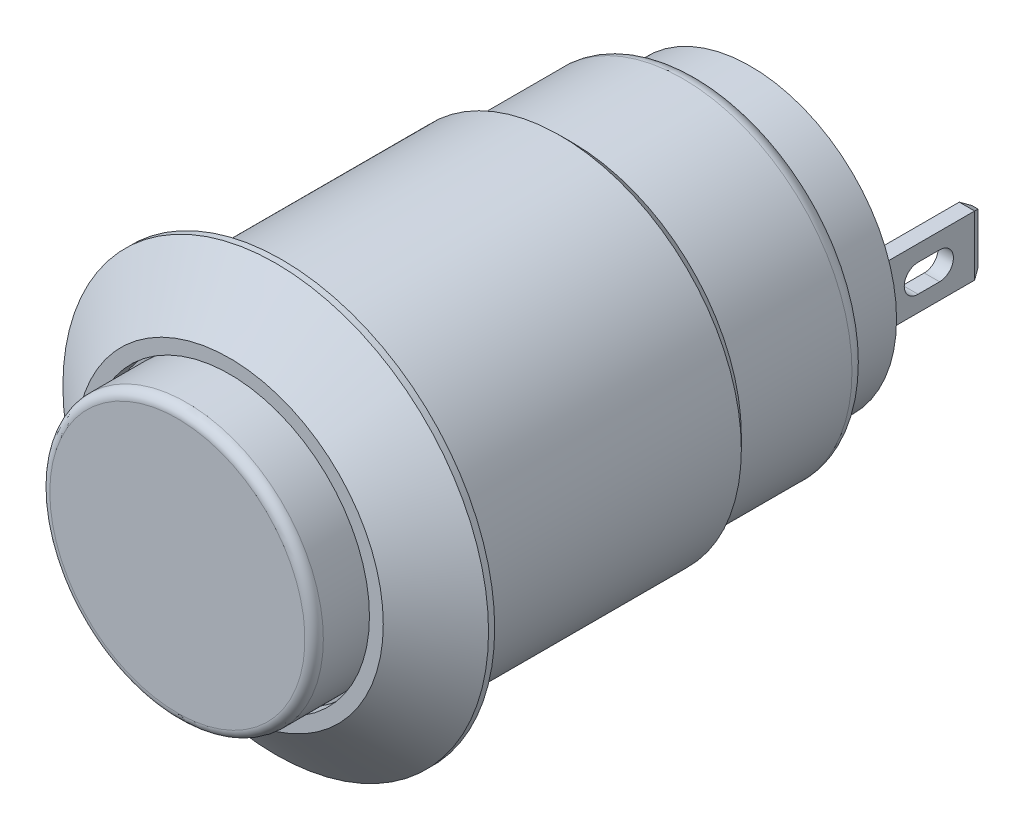
ISO-10303-21;
HEADER;
FILE_DESCRIPTION(('STEP AP214'),'2;1');
FILE_NAME('part.step','',(''),(''),'','','');
FILE_SCHEMA(('AUTOMOTIVE_DESIGN { 1 0 10303 214 1 1 1 1 }'));
ENDSEC;
DATA;
#1=APPLICATION_CONTEXT('core data for automotive mechanical design processes');
#2=APPLICATION_PROTOCOL_DEFINITION('international standard','automotive_design',2000,#1);
#3=PRODUCT_CONTEXT('',#1,'mechanical');
#4=PRODUCT('Part','Part','',(#3));
#5=PRODUCT_RELATED_PRODUCT_CATEGORY('part','',(#4));
#6=PRODUCT_DEFINITION_FORMATION('','',#4);
#7=PRODUCT_DEFINITION_CONTEXT('part definition',#1,'design');
#8=PRODUCT_DEFINITION('design','',#6,#7);
#9=PRODUCT_DEFINITION_SHAPE('','',#8);
#10=(LENGTH_UNIT() NAMED_UNIT(*) SI_UNIT(.MILLI.,.METRE.));
#11=(NAMED_UNIT(*) PLANE_ANGLE_UNIT() SI_UNIT($,.RADIAN.));
#12=(NAMED_UNIT(*) SI_UNIT($,.STERADIAN.) SOLID_ANGLE_UNIT());
#13=UNCERTAINTY_MEASURE_WITH_UNIT(LENGTH_MEASURE(1.E-05),#10,'distance_accuracy_value','');
#14=(GEOMETRIC_REPRESENTATION_CONTEXT(3) GLOBAL_UNCERTAINTY_ASSIGNED_CONTEXT((#13)) GLOBAL_UNIT_ASSIGNED_CONTEXT((#10,
#11,#12)) REPRESENTATION_CONTEXT('',''));
#15=CARTESIAN_POINT('',(0.,0.,0.));
#16=DIRECTION('',(0.,0.,1.));
#17=DIRECTION('',(1.,0.,0.));
#18=AXIS2_PLACEMENT_3D('',#15,#16,#17);
#19=CARTESIAN_POINT('',(0.,4.75,-18.65));
#20=DIRECTION('',(0.,0.,1.));
#21=DIRECTION('',(1.,0.,0.));
#22=AXIS2_PLACEMENT_3D('',#19,#20,#21);
#23=PLANE('',#22);
#24=DIRECTION('',(0.,1.,0.));
#25=VECTOR('',#24,1.);
#26=CARTESIAN_POINT('',(3.45,-0.975,-18.65));
#27=LINE('',#26,#25);
#28=CARTESIAN_POINT('',(3.45,-0.975,-18.65));
#29=VERTEX_POINT('',#28);
#30=CARTESIAN_POINT('',(3.45,0.975,-18.65));
#31=VERTEX_POINT('',#30);
#32=EDGE_CURVE('E389',#29,#31,#27,.T.);
#33=ORIENTED_EDGE('',*,*,#32,.F.);
#34=DIRECTION('',(-1.,0.,0.));
#35=VECTOR('',#34,1.);
#36=CARTESIAN_POINT('',(3.95,-0.975,-18.65));
#37=LINE('',#36,#35);
#38=CARTESIAN_POINT('',(3.95,-0.975,-18.65));
#39=VERTEX_POINT('',#38);
#40=EDGE_CURVE('E377',#39,#29,#37,.T.);
#41=ORIENTED_EDGE('',*,*,#40,.F.);
#42=DIRECTION('',(0.,-1.,0.));
#43=VECTOR('',#42,1.);
#44=CARTESIAN_POINT('',(3.95,-0.975,-18.65));
#45=LINE('',#44,#43);
#46=CARTESIAN_POINT('',(3.95,0.975,-18.65));
#47=VERTEX_POINT('',#46);
#48=EDGE_CURVE('E381',#47,#39,#45,.T.);
#49=ORIENTED_EDGE('',*,*,#48,.F.);
#50=DIRECTION('',(1.,0.,0.));
#51=VECTOR('',#50,1.);
#52=CARTESIAN_POINT('',(3.95,0.975,-18.65));
#53=LINE('',#52,#51);
#54=EDGE_CURVE('E385',#31,#47,#53,.T.);
#55=ORIENTED_EDGE('',*,*,#54,.F.);
#56=EDGE_LOOP('',(#33,#41,#49,#55));
#57=FACE_BOUND('',#56,.T.);
#58=CARTESIAN_POINT('',(0.,0.,-18.65));
#59=DIRECTION('',(0.,0.,1.));
#60=DIRECTION('',(1.,0.,0.));
#61=AXIS2_PLACEMENT_3D('',#58,#59,#60);
#62=CIRCLE('',#61,4.75);
#63=CARTESIAN_POINT('',(4.75,0.,-18.65));
#64=VERTEX_POINT('',#63);
#65=EDGE_CURVE('E361',#64,#64,#62,.T.);
#66=ORIENTED_EDGE('',*,*,#65,.F.);
#67=EDGE_LOOP('',(#66));
#68=FACE_BOUND('',#67,.T.);
#69=DIRECTION('',(0.,1.,0.));
#70=VECTOR('',#69,1.);
#71=CARTESIAN_POINT('',(-3.95,-0.975,-18.65));
#72=LINE('',#71,#70);
#73=CARTESIAN_POINT('',(-3.95,-0.975,-18.65));
#74=VERTEX_POINT('',#73);
#75=CARTESIAN_POINT('',(-3.95,0.975,-18.65));
#76=VERTEX_POINT('',#75);
#77=EDGE_CURVE('E244',#74,#76,#72,.T.);
#78=ORIENTED_EDGE('',*,*,#77,.F.);
#79=DIRECTION('',(-1.,0.,0.));
#80=VECTOR('',#79,1.);
#81=CARTESIAN_POINT('',(-3.45,-0.975,-18.65));
#82=LINE('',#81,#80);
#83=CARTESIAN_POINT('',(-3.45,-0.974999999999999,-18.65));
#84=VERTEX_POINT('',#83);
#85=EDGE_CURVE('E405',#84,#74,#82,.T.);
#86=ORIENTED_EDGE('',*,*,#85,.F.);
#87=DIRECTION('',(0.,-1.,0.));
#88=VECTOR('',#87,1.);
#89=CARTESIAN_POINT('',(-3.45,-0.975,-18.65));
#90=LINE('',#89,#88);
#91=CARTESIAN_POINT('',(-3.45,0.975,-18.65));
#92=VERTEX_POINT('',#91);
#93=EDGE_CURVE('E409',#92,#84,#90,.T.);
#94=ORIENTED_EDGE('',*,*,#93,.F.);
#95=DIRECTION('',(1.,0.,0.));
#96=VECTOR('',#95,1.);
#97=CARTESIAN_POINT('',(-3.45,0.975,-18.65));
#98=LINE('',#97,#96);
#99=EDGE_CURVE('E413',#76,#92,#98,.T.);
#100=ORIENTED_EDGE('',*,*,#99,.F.);
#101=EDGE_LOOP('',(#78,#86,#94,#100));
#102=FACE_BOUND('',#101,.T.);
#103=ADVANCED_FACE('F55',(#57,#68,#102),#23,.F.);
#104=CARTESIAN_POINT('',(0.,0.,0.));
#105=DIRECTION('',(0.,0.,-1.));
#106=DIRECTION('',(-1.,0.,0.));
#107=AXIS2_PLACEMENT_3D('',#104,#105,#106);
#108=PLANE('',#107);
#109=CARTESIAN_POINT('',(0.,0.,0.));
#110=DIRECTION('',(0.,0.,-1.));
#111=DIRECTION('',(-1.,0.,0.));
#112=AXIS2_PLACEMENT_3D('',#109,#110,#111);
#113=CIRCLE('',#112,4.15);
#114=CARTESIAN_POINT('',(-4.15,0.,0.));
#115=VERTEX_POINT('',#114);
#116=EDGE_CURVE('E309',#115,#115,#113,.F.);
#117=ORIENTED_EDGE('',*,*,#116,.T.);
#118=EDGE_LOOP('',(#117));
#119=FACE_BOUND('',#118,.T.);
#120=ADVANCED_FACE('F499',(#119),#108,.F.);
#121=CARTESIAN_POINT('',(0.,0.,0.));
#122=DIRECTION('',(0.,0.,1.));
#123=DIRECTION('',(1.,0.,0.));
#124=AXIS2_PLACEMENT_3D('',#121,#122,#123);
#125=CYLINDRICAL_SURFACE('',#124,4.45);
#126=CARTESIAN_POINT('',(0.,0.,-0.3));
#127=DIRECTION('',(0.,0.,-1.));
#128=DIRECTION('',(-1.,0.,0.));
#129=AXIS2_PLACEMENT_3D('',#126,#127,#128);
#130=CIRCLE('',#129,4.45);
#131=CARTESIAN_POINT('',(-4.45,0.,-0.3));
#132=VERTEX_POINT('',#131);
#133=EDGE_CURVE('E305',#132,#132,#130,.T.);
#134=ORIENTED_EDGE('',*,*,#133,.T.);
#135=EDGE_LOOP('',(#134));
#136=FACE_BOUND('',#135,.T.);
#137=CARTESIAN_POINT('',(0.,0.,-2.2));
#138=DIRECTION('',(0.,0.,1.));
#139=DIRECTION('',(1.,0.,0.));
#140=AXIS2_PLACEMENT_3D('',#137,#138,#139);
#141=CIRCLE('',#140,4.45);
#142=CARTESIAN_POINT('',(4.45,0.,-2.2));
#143=VERTEX_POINT('',#142);
#144=EDGE_CURVE('E321',#143,#143,#141,.T.);
#145=ORIENTED_EDGE('',*,*,#144,.T.);
#146=EDGE_LOOP('',(#145));
#147=FACE_BOUND('',#146,.T.);
#148=ADVANCED_FACE('F505',(#136,#147),#125,.T.);
#149=CARTESIAN_POINT('',(0.,4.45,-2.2));
#150=DIRECTION('',(0.,0.,-1.));
#151=DIRECTION('',(-1.,0.,0.));
#152=AXIS2_PLACEMENT_3D('',#149,#150,#151);
#153=PLANE('',#152);
#154=ORIENTED_EDGE('',*,*,#144,.F.);
#155=EDGE_LOOP('',(#154));
#156=FACE_BOUND('',#155,.T.);
#157=CARTESIAN_POINT('',(0.,0.,-2.2));
#158=DIRECTION('',(0.,0.,1.));
#159=DIRECTION('',(1.,0.,0.));
#160=AXIS2_PLACEMENT_3D('',#157,#158,#159);
#161=CIRCLE('',#160,4.55);
#162=CARTESIAN_POINT('',(4.55,0.,-2.2));
#163=VERTEX_POINT('',#162);
#164=EDGE_CURVE('E325',#163,#163,#161,.T.);
#165=ORIENTED_EDGE('',*,*,#164,.T.);
#166=EDGE_LOOP('',(#165));
#167=FACE_BOUND('',#166,.T.);
#168=ADVANCED_FACE('F554',(#156,#167),#153,.F.);
#169=CARTESIAN_POINT('',(0.,0.,0.));
#170=DIRECTION('',(0.,0.,1.));
#171=DIRECTION('',(1.,0.,0.));
#172=AXIS2_PLACEMENT_3D('',#169,#170,#171);
#173=CYLINDRICAL_SURFACE('',#172,4.55);
#174=ORIENTED_EDGE('',*,*,#164,.F.);
#175=EDGE_LOOP('',(#174));
#176=FACE_BOUND('',#175,.T.);
#177=CARTESIAN_POINT('',(0.,0.,-1.7));
#178=DIRECTION('',(0.,0.,1.));
#179=DIRECTION('',(1.,0.,0.));
#180=AXIS2_PLACEMENT_3D('',#177,#178,#179);
#181=CIRCLE('',#180,4.55);
#182=CARTESIAN_POINT('',(4.55,0.,-1.7));
#183=VERTEX_POINT('',#182);
#184=EDGE_CURVE('E329',#183,#183,#181,.T.);
#185=ORIENTED_EDGE('',*,*,#184,.T.);
#186=EDGE_LOOP('',(#185));
#187=FACE_BOUND('',#186,.T.);
#188=ADVANCED_FACE('F550',(#176,#187),#173,.F.);
#189=CARTESIAN_POINT('',(0.,4.55,-1.7));
#190=DIRECTION('',(0.,0.,-1.));
#191=DIRECTION('',(-1.,0.,0.));
#192=AXIS2_PLACEMENT_3D('',#189,#190,#191);
#193=PLANE('',#192);
#194=ORIENTED_EDGE('',*,*,#184,.F.);
#195=EDGE_LOOP('',(#194));
#196=FACE_BOUND('',#195,.T.);
#197=CARTESIAN_POINT('',(0.,0.,-1.7));
#198=DIRECTION('',(0.,0.,1.));
#199=DIRECTION('',(1.,0.,0.));
#200=AXIS2_PLACEMENT_3D('',#197,#198,#199);
#201=CIRCLE('',#200,5.);
#202=CARTESIAN_POINT('',(5.,0.,-1.7));
#203=VERTEX_POINT('',#202);
#204=EDGE_CURVE('E333',#203,#203,#201,.T.);
#205=ORIENTED_EDGE('',*,*,#204,.T.);
#206=EDGE_LOOP('',(#205));
#207=FACE_BOUND('',#206,.T.);
#208=ADVANCED_FACE('F546',(#196,#207),#193,.F.);
#209=CARTESIAN_POINT('',(0.,0.,-3.2));
#210=DIRECTION('',(0.,0.,-1.));
#211=DIRECTION('',(-1.,0.,0.));
#212=AXIS2_PLACEMENT_3D('',#209,#210,#211);
#213=CONICAL_SURFACE('',#212,6.925,0.908854685589389);
#214=ORIENTED_EDGE('',*,*,#204,.F.);
#215=EDGE_LOOP('',(#214));
#216=FACE_BOUND('',#215,.T.);
#217=CARTESIAN_POINT('',(0.,0.,-3.2));
#218=DIRECTION('',(0.,0.,1.));
#219=DIRECTION('',(1.,0.,0.));
#220=AXIS2_PLACEMENT_3D('',#217,#218,#219);
#221=CIRCLE('',#220,6.925);
#222=CARTESIAN_POINT('',(6.925,0.,-3.2));
#223=VERTEX_POINT('',#222);
#224=EDGE_CURVE('E337',#223,#223,#221,.T.);
#225=ORIENTED_EDGE('',*,*,#224,.T.);
#226=EDGE_LOOP('',(#225));
#227=FACE_BOUND('',#226,.T.);
#228=ADVANCED_FACE('F542',(#216,#227),#213,.T.);
#229=CARTESIAN_POINT('',(0.,0.,0.));
#230=DIRECTION('',(0.,0.,1.));
#231=DIRECTION('',(1.,0.,0.));
#232=AXIS2_PLACEMENT_3D('',#229,#230,#231);
#233=CYLINDRICAL_SURFACE('',#232,6.925);
#234=ORIENTED_EDGE('',*,*,#224,.F.);
#235=EDGE_LOOP('',(#234));
#236=FACE_BOUND('',#235,.T.);
#237=CARTESIAN_POINT('',(0.,0.,-3.4));
#238=DIRECTION('',(0.,0.,1.));
#239=DIRECTION('',(1.,0.,0.));
#240=AXIS2_PLACEMENT_3D('',#237,#238,#239);
#241=CIRCLE('',#240,6.925);
#242=CARTESIAN_POINT('',(6.925,0.,-3.4));
#243=VERTEX_POINT('',#242);
#244=EDGE_CURVE('E341',#243,#243,#241,.T.);
#245=ORIENTED_EDGE('',*,*,#244,.T.);
#246=EDGE_LOOP('',(#245));
#247=FACE_BOUND('',#246,.T.);
#248=ADVANCED_FACE('F538',(#236,#247),#233,.T.);
#249=CARTESIAN_POINT('',(0.,6.925,-3.4));
#250=DIRECTION('',(0.,0.,1.));
#251=DIRECTION('',(1.,0.,0.));
#252=AXIS2_PLACEMENT_3D('',#249,#250,#251);
#253=PLANE('',#252);
#254=ORIENTED_EDGE('',*,*,#244,.F.);
#255=EDGE_LOOP('',(#254));
#256=FACE_BOUND('',#255,.T.);
#257=CARTESIAN_POINT('',(0.,0.,-3.4));
#258=DIRECTION('',(0.,0.,1.));
#259=DIRECTION('',(1.,0.,0.));
#260=AXIS2_PLACEMENT_3D('',#257,#258,#259);
#261=CIRCLE('',#260,5.9);
#262=CARTESIAN_POINT('',(5.9,0.,-3.4));
#263=VERTEX_POINT('',#262);
#264=EDGE_CURVE('E345',#263,#263,#261,.T.);
#265=ORIENTED_EDGE('',*,*,#264,.T.);
#266=EDGE_LOOP('',(#265));
#267=FACE_BOUND('',#266,.T.);
#268=ADVANCED_FACE('F534',(#256,#267),#253,.F.);
#269=CARTESIAN_POINT('',(0.,0.,0.));
#270=DIRECTION('',(0.,0.,1.));
#271=DIRECTION('',(1.,0.,0.));
#272=AXIS2_PLACEMENT_3D('',#269,#270,#271);
#273=CYLINDRICAL_SURFACE('',#272,5.9);
#274=ORIENTED_EDGE('',*,*,#264,.F.);
#275=EDGE_LOOP('',(#274));
#276=FACE_BOUND('',#275,.T.);
#277=CARTESIAN_POINT('',(0.,0.,-12.45));
#278=DIRECTION('',(0.,0.,1.));
#279=DIRECTION('',(1.,0.,0.));
#280=AXIS2_PLACEMENT_3D('',#277,#278,#279);
#281=CIRCLE('',#280,5.9);
#282=CARTESIAN_POINT('',(5.9,0.,-12.45));
#283=VERTEX_POINT('',#282);
#284=EDGE_CURVE('E349',#283,#283,#281,.T.);
#285=ORIENTED_EDGE('',*,*,#284,.T.);
#286=EDGE_LOOP('',(#285));
#287=FACE_BOUND('',#286,.T.);
#288=ADVANCED_FACE('F530',(#276,#287),#273,.T.);
#289=CARTESIAN_POINT('',(0.,0.,-12.85));
#290=DIRECTION('',(0.,0.,1.));
#291=DIRECTION('',(1.,0.,0.));
#292=AXIS2_PLACEMENT_3D('',#289,#290,#291);
#293=CONICAL_SURFACE('',#292,5.5,0.785398163397453);
#294=ORIENTED_EDGE('',*,*,#284,.F.);
#295=EDGE_LOOP('',(#294));
#296=FACE_BOUND('',#295,.T.);
#297=CARTESIAN_POINT('',(0.,0.,-12.85));
#298=DIRECTION('',(0.,0.,1.));
#299=DIRECTION('',(1.,0.,0.));
#300=AXIS2_PLACEMENT_3D('',#297,#298,#299);
#301=CIRCLE('',#300,5.5);
#302=CARTESIAN_POINT('',(5.5,0.,-12.85));
#303=VERTEX_POINT('',#302);
#304=EDGE_CURVE('E353',#303,#303,#301,.T.);
#305=ORIENTED_EDGE('',*,*,#304,.T.);
#306=EDGE_LOOP('',(#305));
#307=FACE_BOUND('',#306,.T.);
#308=ADVANCED_FACE('F526',(#296,#307),#293,.T.);
#309=CARTESIAN_POINT('',(0.,0.,0.));
#310=DIRECTION('',(0.,0.,1.));
#311=DIRECTION('',(1.,0.,0.));
#312=AXIS2_PLACEMENT_3D('',#309,#310,#311);
#313=CYLINDRICAL_SURFACE('',#312,5.5);
#314=CARTESIAN_POINT('',(0.,0.,-16.45));
#315=DIRECTION('',(0.,0.,1.));
#316=DIRECTION('',(1.,0.,0.));
#317=AXIS2_PLACEMENT_3D('',#314,#315,#316);
#318=CIRCLE('',#317,5.5);
#319=CARTESIAN_POINT('',(5.5,0.,-16.45));
#320=VERTEX_POINT('',#319);
#321=EDGE_CURVE('E317',#320,#320,#318,.T.);
#322=ORIENTED_EDGE('',*,*,#321,.T.);
#323=EDGE_LOOP('',(#322));
#324=FACE_BOUND('',#323,.T.);
#325=ORIENTED_EDGE('',*,*,#304,.F.);
#326=EDGE_LOOP('',(#325));
#327=FACE_BOUND('',#326,.T.);
#328=ADVANCED_FACE('F522',(#324,#327),#313,.T.);
#329=CARTESIAN_POINT('',(0.,5.5,-16.95));
#330=DIRECTION('',(0.,0.,1.));
#331=DIRECTION('',(1.,0.,0.));
#332=AXIS2_PLACEMENT_3D('',#329,#330,#331);
#333=PLANE('',#332);
#334=CARTESIAN_POINT('',(0.,0.,-16.95));
#335=DIRECTION('',(0.,0.,1.));
#336=DIRECTION('',(1.,0.,0.));
#337=AXIS2_PLACEMENT_3D('',#334,#335,#336);
#338=CIRCLE('',#337,5.);
#339=CARTESIAN_POINT('',(5.,0.,-16.95));
#340=VERTEX_POINT('',#339);
#341=EDGE_CURVE('E313',#340,#340,#338,.F.);
#342=ORIENTED_EDGE('',*,*,#341,.T.);
#343=EDGE_LOOP('',(#342));
#344=FACE_BOUND('',#343,.T.);
#345=CARTESIAN_POINT('',(0.,0.,-16.95));
#346=DIRECTION('',(0.,0.,1.));
#347=DIRECTION('',(1.,0.,0.));
#348=AXIS2_PLACEMENT_3D('',#345,#346,#347);
#349=CIRCLE('',#348,4.75);
#350=CARTESIAN_POINT('',(4.75,0.,-16.95));
#351=VERTEX_POINT('',#350);
#352=EDGE_CURVE('E357',#351,#351,#349,.T.);
#353=ORIENTED_EDGE('',*,*,#352,.T.);
#354=EDGE_LOOP('',(#353));
#355=FACE_BOUND('',#354,.T.);
#356=ADVANCED_FACE('F518',(#344,#355),#333,.F.);
#357=CARTESIAN_POINT('',(0.,0.,0.));
#358=DIRECTION('',(0.,0.,1.));
#359=DIRECTION('',(1.,0.,0.));
#360=AXIS2_PLACEMENT_3D('',#357,#358,#359);
#361=CYLINDRICAL_SURFACE('',#360,4.75);
#362=ORIENTED_EDGE('',*,*,#352,.F.);
#363=EDGE_LOOP('',(#362));
#364=FACE_BOUND('',#363,.T.);
#365=ORIENTED_EDGE('',*,*,#65,.T.);
#366=EDGE_LOOP('',(#365));
#367=FACE_BOUND('',#366,.T.);
#368=ADVANCED_FACE('F514',(#364,#367),#361,.T.);
#369=CARTESIAN_POINT('',(0.,0.,-16.45));
#370=DIRECTION('',(0.,0.,1.));
#371=DIRECTION('',(1.,0.,0.));
#372=AXIS2_PLACEMENT_3D('',#369,#370,#371);
#373=TOROIDAL_SURFACE('',#372,5.,0.5);
#374=ORIENTED_EDGE('',*,*,#341,.F.);
#375=EDGE_LOOP('',(#374));
#376=FACE_BOUND('',#375,.T.);
#377=ORIENTED_EDGE('',*,*,#321,.F.);
#378=EDGE_LOOP('',(#377));
#379=FACE_BOUND('',#378,.T.);
#380=ADVANCED_FACE('F517',(#376,#379),#373,.T.);
#381=CARTESIAN_POINT('',(0.,0.,-0.3));
#382=DIRECTION('',(0.,0.,-1.));
#383=DIRECTION('',(-1.,0.,0.));
#384=AXIS2_PLACEMENT_3D('',#381,#382,#383);
#385=TOROIDAL_SURFACE('',#384,4.15,0.3);
#386=ORIENTED_EDGE('',*,*,#133,.F.);
#387=EDGE_LOOP('',(#386));
#388=FACE_BOUND('',#387,.T.);
#389=ORIENTED_EDGE('',*,*,#116,.F.);
#390=EDGE_LOOP('',(#389));
#391=FACE_BOUND('',#390,.T.);
#392=ADVANCED_FACE('F564',(#388,#391),#385,.T.);
#393=CARTESIAN_POINT('',(3.45,-0.975,-22.25));
#394=DIRECTION('',(1.,0.,0.));
#395=DIRECTION('',(0.,0.,-1.));
#396=AXIS2_PLACEMENT_3D('',#393,#394,#395);
#397=PLANE('',#396);
#398=DIRECTION('',(0.,0.,1.));
#399=VECTOR('',#398,1.);
#400=CARTESIAN_POINT('',(3.45,0.45,-22.25));
#401=LINE('',#400,#399);
#402=CARTESIAN_POINT('',(3.45,0.45,-20.85));
#403=VERTEX_POINT('',#402);
#404=CARTESIAN_POINT('',(3.45,0.45,-20.15));
#405=VERTEX_POINT('',#404);
#406=EDGE_CURVE('E431',#403,#405,#401,.T.);
#407=ORIENTED_EDGE('',*,*,#406,.T.);
#408=CARTESIAN_POINT('',(3.45,0.,-20.15));
#409=DIRECTION('',(1.,0.,0.));
#410=DIRECTION('',(0.,0.,-1.));
#411=AXIS2_PLACEMENT_3D('',#408,#409,#410);
#412=CIRCLE('',#411,0.45);
#413=CARTESIAN_POINT('',(3.45,-0.45,-20.15));
#414=VERTEX_POINT('',#413);
#415=EDGE_CURVE('E239',#405,#414,#412,.T.);
#416=ORIENTED_EDGE('',*,*,#415,.T.);
#417=DIRECTION('',(0.,0.,-1.));
#418=VECTOR('',#417,1.);
#419=CARTESIAN_POINT('',(3.45,-0.45,-22.25));
#420=LINE('',#419,#418);
#421=CARTESIAN_POINT('',(3.45,-0.45,-20.85));
#422=VERTEX_POINT('',#421);
#423=EDGE_CURVE('E453',#414,#422,#420,.T.);
#424=ORIENTED_EDGE('',*,*,#423,.T.);
#425=CARTESIAN_POINT('',(3.45,0.,-20.85));
#426=DIRECTION('',(1.,0.,0.));
#427=DIRECTION('',(0.,0.,-1.));
#428=AXIS2_PLACEMENT_3D('',#425,#426,#427);
#429=CIRCLE('',#428,0.45);
#430=EDGE_CURVE('E443',#422,#403,#429,.T.);
#431=ORIENTED_EDGE('',*,*,#430,.T.);
#432=EDGE_LOOP('',(#407,#416,#424,#431));
#433=FACE_BOUND('',#432,.T.);
#434=DIRECTION('',(0.,0.,1.));
#435=VECTOR('',#434,1.);
#436=CARTESIAN_POINT('',(3.45,0.975,-22.25));
#437=LINE('',#436,#435);
#438=CARTESIAN_POINT('',(3.45,0.975,-21.9901923788647));
#439=VERTEX_POINT('',#438);
#440=EDGE_CURVE('E365',#439,#31,#437,.T.);
#441=ORIENTED_EDGE('',*,*,#440,.F.);
#442=DIRECTION('',(0.,-1.,0.));
#443=VECTOR('',#442,1.);
#444=CARTESIAN_POINT('',(3.45,-0.975,-21.9901923788647));
#445=LINE('',#444,#443);
#446=CARTESIAN_POINT('',(3.45,-0.975,-21.9901923788647));
#447=VERTEX_POINT('',#446);
#448=EDGE_CURVE('E204',#439,#447,#445,.T.);
#449=ORIENTED_EDGE('',*,*,#448,.T.);
#450=DIRECTION('',(0.,0.,1.));
#451=VECTOR('',#450,1.);
#452=CARTESIAN_POINT('',(3.45,-0.975,-22.25));
#453=LINE('',#452,#451);
#454=EDGE_CURVE('E374',#447,#29,#453,.T.);
#455=ORIENTED_EDGE('',*,*,#454,.T.);
#456=ORIENTED_EDGE('',*,*,#32,.T.);
#457=EDGE_LOOP('',(#441,#449,#455,#456));
#458=FACE_BOUND('',#457,.T.);
#459=ADVANCED_FACE('F512',(#433,#458),#397,.F.);
#460=CARTESIAN_POINT('',(3.95,0.975,-22.25));
#461=DIRECTION('',(0.,-1.,0.));
#462=DIRECTION('',(0.,0.,-1.));
#463=AXIS2_PLACEMENT_3D('',#460,#461,#462);
#464=PLANE('',#463);
#465=DIRECTION('',(0.,0.,1.));
#466=VECTOR('',#465,1.);
#467=CARTESIAN_POINT('',(3.95,0.975,-22.25));
#468=LINE('',#467,#466);
#469=CARTESIAN_POINT('',(3.95,0.975,-21.9901923788647));
#470=VERTEX_POINT('',#469);
#471=EDGE_CURVE('E368',#470,#47,#468,.T.);
#472=ORIENTED_EDGE('',*,*,#471,.F.);
#473=DIRECTION('',(-1.,0.,0.));
#474=VECTOR('',#473,1.);
#475=CARTESIAN_POINT('',(3.95,0.975,-21.9901923788647));
#476=LINE('',#475,#474);
#477=EDGE_CURVE('E256',#470,#439,#476,.T.);
#478=ORIENTED_EDGE('',*,*,#477,.T.);
#479=ORIENTED_EDGE('',*,*,#440,.T.);
#480=ORIENTED_EDGE('',*,*,#54,.T.);
#481=EDGE_LOOP('',(#472,#478,#479,#480));
#482=FACE_BOUND('',#481,.T.);
#483=ADVANCED_FACE('F631',(#482),#464,.F.);
#484=CARTESIAN_POINT('',(3.95,-0.975,-22.25));
#485=DIRECTION('',(-1.,0.,0.));
#486=DIRECTION('',(0.,0.,1.));
#487=AXIS2_PLACEMENT_3D('',#484,#485,#486);
#488=PLANE('',#487);
#489=DIRECTION('',(0.,0.,1.));
#490=VECTOR('',#489,1.);
#491=CARTESIAN_POINT('',(3.95,-0.45,-22.25));
#492=LINE('',#491,#490);
#493=CARTESIAN_POINT('',(3.95,-0.45,-20.85));
#494=VERTEX_POINT('',#493);
#495=CARTESIAN_POINT('',(3.95,-0.45,-20.15));
#496=VERTEX_POINT('',#495);
#497=EDGE_CURVE('E456',#494,#496,#492,.T.);
#498=ORIENTED_EDGE('',*,*,#497,.T.);
#499=CARTESIAN_POINT('',(3.95,0.,-20.15));
#500=DIRECTION('',(-1.,0.,0.));
#501=DIRECTION('',(0.,0.,1.));
#502=AXIS2_PLACEMENT_3D('',#499,#500,#501);
#503=CIRCLE('',#502,0.45);
#504=CARTESIAN_POINT('',(3.95,0.45,-20.15));
#505=VERTEX_POINT('',#504);
#506=EDGE_CURVE('E423',#496,#505,#503,.T.);
#507=ORIENTED_EDGE('',*,*,#506,.T.);
#508=DIRECTION('',(0.,0.,-1.));
#509=VECTOR('',#508,1.);
#510=CARTESIAN_POINT('',(3.95,0.45,-22.25));
#511=LINE('',#510,#509);
#512=CARTESIAN_POINT('',(3.95,0.45,-20.85));
#513=VERTEX_POINT('',#512);
#514=EDGE_CURVE('E435',#505,#513,#511,.T.);
#515=ORIENTED_EDGE('',*,*,#514,.T.);
#516=CARTESIAN_POINT('',(3.95,0.,-20.85));
#517=DIRECTION('',(-1.,0.,0.));
#518=DIRECTION('',(0.,0.,1.));
#519=AXIS2_PLACEMENT_3D('',#516,#517,#518);
#520=CIRCLE('',#519,0.45);
#521=EDGE_CURVE('E447',#513,#494,#520,.T.);
#522=ORIENTED_EDGE('',*,*,#521,.T.);
#523=EDGE_LOOP('',(#498,#507,#515,#522));
#524=FACE_BOUND('',#523,.T.);
#525=DIRECTION('',(0.,0.,1.));
#526=VECTOR('',#525,1.);
#527=CARTESIAN_POINT('',(3.95,-0.975,-22.25));
#528=LINE('',#527,#526);
#529=CARTESIAN_POINT('',(3.95,-0.975,-21.9901923788647));
#530=VERTEX_POINT('',#529);
#531=EDGE_CURVE('E371',#530,#39,#528,.T.);
#532=ORIENTED_EDGE('',*,*,#531,.F.);
#533=DIRECTION('',(0.,1.,0.));
#534=VECTOR('',#533,1.);
#535=CARTESIAN_POINT('',(3.95,-0.975,-21.9901923788647));
#536=LINE('',#535,#534);
#537=EDGE_CURVE('E259',#530,#470,#536,.T.);
#538=ORIENTED_EDGE('',*,*,#537,.T.);
#539=ORIENTED_EDGE('',*,*,#471,.T.);
#540=ORIENTED_EDGE('',*,*,#48,.T.);
#541=EDGE_LOOP('',(#532,#538,#539,#540));
#542=FACE_BOUND('',#541,.T.);
#543=ADVANCED_FACE('F642',(#524,#542),#488,.F.);
#544=CARTESIAN_POINT('',(3.95,-0.975,-22.25));
#545=DIRECTION('',(0.,1.,0.));
#546=DIRECTION('',(0.,0.,1.));
#547=AXIS2_PLACEMENT_3D('',#544,#545,#546);
#548=PLANE('',#547);
#549=ORIENTED_EDGE('',*,*,#454,.F.);
#550=DIRECTION('',(1.,0.,0.));
#551=VECTOR('',#550,1.);
#552=CARTESIAN_POINT('',(3.95,-0.975,-21.9901923788647));
#553=LINE('',#552,#551);
#554=EDGE_CURVE('E262',#447,#530,#553,.T.);
#555=ORIENTED_EDGE('',*,*,#554,.T.);
#556=ORIENTED_EDGE('',*,*,#531,.T.);
#557=ORIENTED_EDGE('',*,*,#40,.T.);
#558=EDGE_LOOP('',(#549,#555,#556,#557));
#559=FACE_BOUND('',#558,.T.);
#560=ADVANCED_FACE('F638',(#559),#548,.F.);
#561=CARTESIAN_POINT('',(0.,0.,-22.25));
#562=DIRECTION('',(0.,0.,1.));
#563=DIRECTION('',(1.,0.,0.));
#564=AXIS2_PLACEMENT_3D('',#561,#562,#563);
#565=PLANE('',#564);
#566=DIRECTION('',(0.,-1.,0.));
#567=VECTOR('',#566,1.);
#568=CARTESIAN_POINT('',(3.8,0.,-22.25));
#569=LINE('',#568,#567);
#570=CARTESIAN_POINT('',(3.8,0.824999999999996,-22.25));
#571=VERTEX_POINT('',#570);
#572=CARTESIAN_POINT('',(3.8,-0.824999999999996,-22.25));
#573=VERTEX_POINT('',#572);
#574=EDGE_CURVE('E270',#571,#573,#569,.T.);
#575=ORIENTED_EDGE('',*,*,#574,.T.);
#576=DIRECTION('',(-1.,0.,0.));
#577=VECTOR('',#576,1.);
#578=CARTESIAN_POINT('',(0.,-0.824999999999996,-22.25));
#579=LINE('',#578,#577);
#580=CARTESIAN_POINT('',(3.6,-0.824999999999996,-22.25));
#581=VERTEX_POINT('',#580);
#582=EDGE_CURVE('E266',#573,#581,#579,.T.);
#583=ORIENTED_EDGE('',*,*,#582,.T.);
#584=DIRECTION('',(0.,1.,0.));
#585=VECTOR('',#584,1.);
#586=CARTESIAN_POINT('',(3.6,0.,-22.25));
#587=LINE('',#586,#585);
#588=CARTESIAN_POINT('',(3.6,0.824999999999996,-22.25));
#589=VERTEX_POINT('',#588);
#590=EDGE_CURVE('E276',#581,#589,#587,.T.);
#591=ORIENTED_EDGE('',*,*,#590,.T.);
#592=DIRECTION('',(1.,0.,0.));
#593=VECTOR('',#592,1.);
#594=CARTESIAN_POINT('',(0.,0.824999999999996,-22.25));
#595=LINE('',#594,#593);
#596=EDGE_CURVE('E273',#589,#571,#595,.T.);
#597=ORIENTED_EDGE('',*,*,#596,.T.);
#598=EDGE_LOOP('',(#575,#583,#591,#597));
#599=FACE_BOUND('',#598,.T.);
#600=ADVANCED_FACE('F649',(#599),#565,.F.);
#601=CARTESIAN_POINT('',(-3.95,-0.975,-22.25));
#602=DIRECTION('',(1.,0.,0.));
#603=DIRECTION('',(0.,0.,-1.));
#604=AXIS2_PLACEMENT_3D('',#601,#602,#603);
#605=PLANE('',#604);
#606=DIRECTION('',(0.,0.,1.));
#607=VECTOR('',#606,1.);
#608=CARTESIAN_POINT('',(-3.95,0.45,-22.25));
#609=LINE('',#608,#607);
#610=CARTESIAN_POINT('',(-3.95,0.45,-20.85));
#611=VERTEX_POINT('',#610);
#612=CARTESIAN_POINT('',(-3.95,0.45,-20.15));
#613=VERTEX_POINT('',#612);
#614=EDGE_CURVE('E439',#611,#613,#609,.T.);
#615=ORIENTED_EDGE('',*,*,#614,.T.);
#616=CARTESIAN_POINT('',(-3.95,0.,-20.15));
#617=DIRECTION('',(1.,0.,0.));
#618=DIRECTION('',(0.,0.,-1.));
#619=AXIS2_PLACEMENT_3D('',#616,#617,#618);
#620=CIRCLE('',#619,0.45);
#621=CARTESIAN_POINT('',(-3.95,-0.45,-20.15));
#622=VERTEX_POINT('',#621);
#623=EDGE_CURVE('E427',#613,#622,#620,.T.);
#624=ORIENTED_EDGE('',*,*,#623,.T.);
#625=DIRECTION('',(0.,0.,-1.));
#626=VECTOR('',#625,1.);
#627=CARTESIAN_POINT('',(-3.95,-0.45,-22.25));
#628=LINE('',#627,#626);
#629=CARTESIAN_POINT('',(-3.95,-0.45,-20.85));
#630=VERTEX_POINT('',#629);
#631=EDGE_CURVE('E460',#622,#630,#628,.T.);
#632=ORIENTED_EDGE('',*,*,#631,.T.);
#633=CARTESIAN_POINT('',(-3.95,0.,-20.85));
#634=DIRECTION('',(1.,0.,0.));
#635=DIRECTION('',(0.,0.,-1.));
#636=AXIS2_PLACEMENT_3D('',#633,#634,#635);
#637=CIRCLE('',#636,0.45);
#638=EDGE_CURVE('E211',#630,#611,#637,.T.);
#639=ORIENTED_EDGE('',*,*,#638,.T.);
#640=EDGE_LOOP('',(#615,#624,#632,#639));
#641=FACE_BOUND('',#640,.T.);
#642=DIRECTION('',(0.,0.,1.));
#643=VECTOR('',#642,1.);
#644=CARTESIAN_POINT('',(-3.95,0.975,-22.25));
#645=LINE('',#644,#643);
#646=CARTESIAN_POINT('',(-3.95,0.975,-21.9901923788647));
#647=VERTEX_POINT('',#646);
#648=EDGE_CURVE('E393',#647,#76,#645,.T.);
#649=ORIENTED_EDGE('',*,*,#648,.F.);
#650=DIRECTION('',(0.,-1.,0.));
#651=VECTOR('',#650,1.);
#652=CARTESIAN_POINT('',(-3.95,-0.975,-21.9901923788647));
#653=LINE('',#652,#651);
#654=CARTESIAN_POINT('',(-3.95,-0.975,-21.9901923788647));
#655=VERTEX_POINT('',#654);
#656=EDGE_CURVE('E279',#647,#655,#653,.T.);
#657=ORIENTED_EDGE('',*,*,#656,.T.);
#658=DIRECTION('',(0.,0.,1.));
#659=VECTOR('',#658,1.);
#660=CARTESIAN_POINT('',(-3.95,-0.975,-22.25));
#661=LINE('',#660,#659);
#662=EDGE_CURVE('E402',#655,#74,#661,.T.);
#663=ORIENTED_EDGE('',*,*,#662,.T.);
#664=ORIENTED_EDGE('',*,*,#77,.T.);
#665=EDGE_LOOP('',(#649,#657,#663,#664));
#666=FACE_BOUND('',#665,.T.);
#667=ADVANCED_FACE('F483',(#641,#666),#605,.F.);
#668=CARTESIAN_POINT('',(-3.45,0.975,-22.25));
#669=DIRECTION('',(0.,-1.,0.));
#670=DIRECTION('',(0.,0.,-1.));
#671=AXIS2_PLACEMENT_3D('',#668,#669,#670);
#672=PLANE('',#671);
#673=DIRECTION('',(0.,0.,1.));
#674=VECTOR('',#673,1.);
#675=CARTESIAN_POINT('',(-3.45,0.975,-22.25));
#676=LINE('',#675,#674);
#677=CARTESIAN_POINT('',(-3.45,0.975,-21.9901923788647));
#678=VERTEX_POINT('',#677);
#679=EDGE_CURVE('E396',#678,#92,#676,.T.);
#680=ORIENTED_EDGE('',*,*,#679,.F.);
#681=DIRECTION('',(-1.,0.,0.));
#682=VECTOR('',#681,1.);
#683=CARTESIAN_POINT('',(-3.45,0.975,-21.9901923788647));
#684=LINE('',#683,#682);
#685=EDGE_CURVE('E282',#678,#647,#684,.T.);
#686=ORIENTED_EDGE('',*,*,#685,.T.);
#687=ORIENTED_EDGE('',*,*,#648,.T.);
#688=ORIENTED_EDGE('',*,*,#99,.T.);
#689=EDGE_LOOP('',(#680,#686,#687,#688));
#690=FACE_BOUND('',#689,.T.);
#691=ADVANCED_FACE('F657',(#690),#672,.F.);
#692=CARTESIAN_POINT('',(-3.45,-0.975,-22.25));
#693=DIRECTION('',(-1.,0.,0.));
#694=DIRECTION('',(0.,0.,1.));
#695=AXIS2_PLACEMENT_3D('',#692,#693,#694);
#696=PLANE('',#695);
#697=DIRECTION('',(0.,0.,1.));
#698=VECTOR('',#697,1.);
#699=CARTESIAN_POINT('',(-3.45,-0.45,-22.25));
#700=LINE('',#699,#698);
#701=CARTESIAN_POINT('',(-3.45,-0.45,-20.85));
#702=VERTEX_POINT('',#701);
#703=CARTESIAN_POINT('',(-3.45,-0.45,-20.15));
#704=VERTEX_POINT('',#703);
#705=EDGE_CURVE('E192',#702,#704,#700,.T.);
#706=ORIENTED_EDGE('',*,*,#705,.T.);
#707=CARTESIAN_POINT('',(-3.45,0.,-20.15));
#708=DIRECTION('',(-1.,0.,0.));
#709=DIRECTION('',(0.,0.,1.));
#710=AXIS2_PLACEMENT_3D('',#707,#708,#709);
#711=CIRCLE('',#710,0.45);
#712=CARTESIAN_POINT('',(-3.45,0.45,-20.15));
#713=VERTEX_POINT('',#712);
#714=EDGE_CURVE('E11',#704,#713,#711,.T.);
#715=ORIENTED_EDGE('',*,*,#714,.T.);
#716=DIRECTION('',(0.,0.,-1.));
#717=VECTOR('',#716,1.);
#718=CARTESIAN_POINT('',(-3.45,0.45,-22.25));
#719=LINE('',#718,#717);
#720=CARTESIAN_POINT('',(-3.45,0.45,-20.85));
#721=VERTEX_POINT('',#720);
#722=EDGE_CURVE('E65',#713,#721,#719,.T.);
#723=ORIENTED_EDGE('',*,*,#722,.T.);
#724=CARTESIAN_POINT('',(-3.45,0.,-20.85));
#725=DIRECTION('',(-1.,0.,0.));
#726=DIRECTION('',(0.,0.,1.));
#727=AXIS2_PLACEMENT_3D('',#724,#725,#726);
#728=CIRCLE('',#727,0.45);
#729=EDGE_CURVE('E203',#721,#702,#728,.T.);
#730=ORIENTED_EDGE('',*,*,#729,.T.);
#731=EDGE_LOOP('',(#706,#715,#723,#730));
#732=FACE_BOUND('',#731,.T.);
#733=DIRECTION('',(0.,0.,1.));
#734=VECTOR('',#733,1.);
#735=CARTESIAN_POINT('',(-3.45,-0.975,-22.25));
#736=LINE('',#735,#734);
#737=CARTESIAN_POINT('',(-3.45,-0.975,-21.9901923788647));
#738=VERTEX_POINT('',#737);
#739=EDGE_CURVE('E399',#738,#84,#736,.T.);
#740=ORIENTED_EDGE('',*,*,#739,.F.);
#741=DIRECTION('',(0.,1.,0.));
#742=VECTOR('',#741,1.);
#743=CARTESIAN_POINT('',(-3.45,-0.975,-21.9901923788647));
#744=LINE('',#743,#742);
#745=EDGE_CURVE('E285',#738,#678,#744,.T.);
#746=ORIENTED_EDGE('',*,*,#745,.T.);
#747=ORIENTED_EDGE('',*,*,#679,.T.);
#748=ORIENTED_EDGE('',*,*,#93,.T.);
#749=EDGE_LOOP('',(#740,#746,#747,#748));
#750=FACE_BOUND('',#749,.T.);
#751=ADVANCED_FACE('F217',(#732,#750),#696,.F.);
#752=CARTESIAN_POINT('',(-3.45,-0.975,-22.25));
#753=DIRECTION('',(0.,1.,0.));
#754=DIRECTION('',(0.,0.,1.));
#755=AXIS2_PLACEMENT_3D('',#752,#753,#754);
#756=PLANE('',#755);
#757=ORIENTED_EDGE('',*,*,#662,.F.);
#758=DIRECTION('',(1.,0.,0.));
#759=VECTOR('',#758,1.);
#760=CARTESIAN_POINT('',(-3.45,-0.975,-21.9901923788647));
#761=LINE('',#760,#759);
#762=EDGE_CURVE('E288',#655,#738,#761,.T.);
#763=ORIENTED_EDGE('',*,*,#762,.T.);
#764=ORIENTED_EDGE('',*,*,#739,.T.);
#765=ORIENTED_EDGE('',*,*,#85,.T.);
#766=EDGE_LOOP('',(#757,#763,#764,#765));
#767=FACE_BOUND('',#766,.T.);
#768=ADVANCED_FACE('F663',(#767),#756,.F.);
#769=CARTESIAN_POINT('',(0.,0.,-22.25));
#770=DIRECTION('',(0.,0.,1.));
#771=DIRECTION('',(1.,0.,0.));
#772=AXIS2_PLACEMENT_3D('',#769,#770,#771);
#773=PLANE('',#772);
#774=DIRECTION('',(0.,-1.,0.));
#775=VECTOR('',#774,1.);
#776=CARTESIAN_POINT('',(-3.6,0.,-22.25));
#777=LINE('',#776,#775);
#778=CARTESIAN_POINT('',(-3.6,0.824999999999996,-22.25));
#779=VERTEX_POINT('',#778);
#780=CARTESIAN_POINT('',(-3.6,-0.824999999999995,-22.25));
#781=VERTEX_POINT('',#780);
#782=EDGE_CURVE('E296',#779,#781,#777,.T.);
#783=ORIENTED_EDGE('',*,*,#782,.T.);
#784=DIRECTION('',(-1.,0.,0.));
#785=VECTOR('',#784,1.);
#786=CARTESIAN_POINT('',(0.,-0.824999999999995,-22.25));
#787=LINE('',#786,#785);
#788=CARTESIAN_POINT('',(-3.8,-0.824999999999995,-22.25));
#789=VERTEX_POINT('',#788);
#790=EDGE_CURVE('E292',#781,#789,#787,.T.);
#791=ORIENTED_EDGE('',*,*,#790,.T.);
#792=DIRECTION('',(0.,1.,0.));
#793=VECTOR('',#792,1.);
#794=CARTESIAN_POINT('',(-3.8,0.,-22.25));
#795=LINE('',#794,#793);
#796=CARTESIAN_POINT('',(-3.8,0.824999999999996,-22.25));
#797=VERTEX_POINT('',#796);
#798=EDGE_CURVE('E302',#789,#797,#795,.T.);
#799=ORIENTED_EDGE('',*,*,#798,.T.);
#800=DIRECTION('',(1.,0.,0.));
#801=VECTOR('',#800,1.);
#802=CARTESIAN_POINT('',(0.,0.824999999999996,-22.25));
#803=LINE('',#802,#801);
#804=EDGE_CURVE('E299',#797,#779,#803,.T.);
#805=ORIENTED_EDGE('',*,*,#804,.T.);
#806=EDGE_LOOP('',(#783,#791,#799,#805));
#807=FACE_BOUND('',#806,.T.);
#808=ADVANCED_FACE('F596',(#807),#773,.F.);
#809=CARTESIAN_POINT('',(0.,0.824999999999996,-22.25));
#810=DIRECTION('',(0.,-0.866025403784438,0.500000000000001));
#811=DIRECTION('',(1.,0.,0.));
#812=AXIS2_PLACEMENT_3D('',#809,#810,#811);
#813=PLANE('',#812);
#814=DIRECTION('',(0.447213595499959,-0.447213595499959,-0.774596669241483));
#815=VECTOR('',#814,1.);
#816=CARTESIAN_POINT('',(-3.635,0.659999999999996,-22.5357883832489));
#817=LINE('',#816,#815);
#818=EDGE_CURVE('E245',#647,#797,#817,.T.);
#819=ORIENTED_EDGE('',*,*,#818,.F.);
#820=ORIENTED_EDGE('',*,*,#685,.F.);
#821=DIRECTION('',(-0.447213595499959,-0.447213595499959,-0.774596669241483));
#822=VECTOR('',#821,1.);
#823=CARTESIAN_POINT('',(-2.88,1.545,-21.0029234185504));
#824=LINE('',#823,#822);
#825=EDGE_CURVE('E240',#779,#678,#824,.F.);
#826=ORIENTED_EDGE('',*,*,#825,.F.);
#827=ORIENTED_EDGE('',*,*,#804,.F.);
#828=EDGE_LOOP('',(#819,#820,#826,#827));
#829=FACE_BOUND('',#828,.T.);
#830=ADVANCED_FACE('F590',(#829),#813,.F.);
#831=CARTESIAN_POINT('',(-3.6,0.,-22.25));
#832=DIRECTION('',(-0.866025403784438,0.,0.500000000000001));
#833=DIRECTION('',(0.,-1.,0.));
#834=AXIS2_PLACEMENT_3D('',#831,#832,#833);
#835=PLANE('',#834);
#836=ORIENTED_EDGE('',*,*,#825,.T.);
#837=ORIENTED_EDGE('',*,*,#745,.F.);
#838=DIRECTION('',(-0.447213595499959,0.447213595499959,-0.774596669241483));
#839=VECTOR('',#838,1.);
#840=CARTESIAN_POINT('',(-3.765,-0.659999999999996,-22.5357883832489));
#841=LINE('',#840,#839);
#842=EDGE_CURVE('E249',#781,#738,#841,.F.);
#843=ORIENTED_EDGE('',*,*,#842,.F.);
#844=ORIENTED_EDGE('',*,*,#782,.F.);
#845=EDGE_LOOP('',(#836,#837,#843,#844));
#846=FACE_BOUND('',#845,.T.);
#847=ADVANCED_FACE('F583',(#846),#835,.F.);
#848=CARTESIAN_POINT('',(-3.8,0.,-22.25));
#849=DIRECTION('',(0.866025403784438,0.,0.500000000000001));
#850=DIRECTION('',(0.,1.,0.));
#851=AXIS2_PLACEMENT_3D('',#848,#849,#850);
#852=PLANE('',#851);
#853=ORIENTED_EDGE('',*,*,#818,.T.);
#854=ORIENTED_EDGE('',*,*,#798,.F.);
#855=DIRECTION('',(-0.447213595499959,-0.447213595499959,0.774596669241483));
#856=VECTOR('',#855,1.);
#857=CARTESIAN_POINT('',(-3.635,-0.659999999999996,-22.5357883832489));
#858=LINE('',#857,#856);
#859=EDGE_CURVE('E228',#655,#789,#858,.F.);
#860=ORIENTED_EDGE('',*,*,#859,.F.);
#861=ORIENTED_EDGE('',*,*,#656,.F.);
#862=EDGE_LOOP('',(#853,#854,#860,#861));
#863=FACE_BOUND('',#862,.T.);
#864=ADVANCED_FACE('F576',(#863),#852,.F.);
#865=CARTESIAN_POINT('',(0.,-0.824999999999995,-22.25));
#866=DIRECTION('',(0.,0.866025403784438,0.500000000000001));
#867=DIRECTION('',(-1.,0.,0.));
#868=AXIS2_PLACEMENT_3D('',#865,#866,#867);
#869=PLANE('',#868);
#870=ORIENTED_EDGE('',*,*,#842,.T.);
#871=ORIENTED_EDGE('',*,*,#762,.F.);
#872=ORIENTED_EDGE('',*,*,#859,.T.);
#873=ORIENTED_EDGE('',*,*,#790,.F.);
#874=EDGE_LOOP('',(#870,#871,#872,#873));
#875=FACE_BOUND('',#874,.T.);
#876=ADVANCED_FACE('F570',(#875),#869,.F.);
#877=CARTESIAN_POINT('',(0.,0.824999999999996,-22.25));
#878=DIRECTION('',(0.,-0.866025403784438,0.500000000000001));
#879=DIRECTION('',(1.,0.,0.));
#880=AXIS2_PLACEMENT_3D('',#877,#878,#879);
#881=PLANE('',#880);
#882=DIRECTION('',(0.447213595499959,-0.447213595499959,-0.774596669241483));
#883=VECTOR('',#882,1.);
#884=CARTESIAN_POINT('',(3.765,0.659999999999996,-22.5357883832489));
#885=LINE('',#884,#883);
#886=EDGE_CURVE('E229',#439,#589,#885,.T.);
#887=ORIENTED_EDGE('',*,*,#886,.F.);
#888=ORIENTED_EDGE('',*,*,#477,.F.);
#889=DIRECTION('',(-0.447213595499959,-0.447213595499959,-0.774596669241483));
#890=VECTOR('',#889,1.);
#891=CARTESIAN_POINT('',(3.04,0.0649999999999942,-23.5663586137523));
#892=LINE('',#891,#890);
#893=EDGE_CURVE('E225',#571,#470,#892,.F.);
#894=ORIENTED_EDGE('',*,*,#893,.F.);
#895=ORIENTED_EDGE('',*,*,#596,.F.);
#896=EDGE_LOOP('',(#887,#888,#894,#895));
#897=FACE_BOUND('',#896,.T.);
#898=ADVANCED_FACE('F58',(#897),#881,.F.);
#899=CARTESIAN_POINT('',(3.8,0.,-22.25));
#900=DIRECTION('',(-0.866025403784438,0.,0.500000000000001));
#901=DIRECTION('',(0.,-1.,0.));
#902=AXIS2_PLACEMENT_3D('',#899,#900,#901);
#903=PLANE('',#902);
#904=ORIENTED_EDGE('',*,*,#893,.T.);
#905=ORIENTED_EDGE('',*,*,#537,.F.);
#906=DIRECTION('',(-0.447213595499959,0.447213595499959,-0.774596669241483));
#907=VECTOR('',#906,1.);
#908=CARTESIAN_POINT('',(3.635,-0.659999999999996,-22.5357883832489));
#909=LINE('',#908,#907);
#910=EDGE_CURVE('E233',#573,#530,#909,.F.);
#911=ORIENTED_EDGE('',*,*,#910,.F.);
#912=ORIENTED_EDGE('',*,*,#574,.F.);
#913=EDGE_LOOP('',(#904,#905,#911,#912));
#914=FACE_BOUND('',#913,.T.);
#915=ADVANCED_FACE('F611',(#914),#903,.F.);
#916=CARTESIAN_POINT('',(3.6,0.,-22.25));
#917=DIRECTION('',(0.866025403784438,0.,0.500000000000001));
#918=DIRECTION('',(0.,1.,0.));
#919=AXIS2_PLACEMENT_3D('',#916,#917,#918);
#920=PLANE('',#919);
#921=ORIENTED_EDGE('',*,*,#886,.T.);
#922=ORIENTED_EDGE('',*,*,#590,.F.);
#923=DIRECTION('',(-0.447213595499959,-0.447213595499959,0.774596669241483));
#924=VECTOR('',#923,1.);
#925=CARTESIAN_POINT('',(3.765,-0.659999999999996,-22.5357883832489));
#926=LINE('',#925,#924);
#927=EDGE_CURVE('E236',#447,#581,#926,.F.);
#928=ORIENTED_EDGE('',*,*,#927,.F.);
#929=ORIENTED_EDGE('',*,*,#448,.F.);
#930=EDGE_LOOP('',(#921,#922,#928,#929));
#931=FACE_BOUND('',#930,.T.);
#932=ADVANCED_FACE('F605',(#931),#920,.F.);
#933=CARTESIAN_POINT('',(0.,-0.824999999999996,-22.25));
#934=DIRECTION('',(0.,0.866025403784438,0.500000000000001));
#935=DIRECTION('',(-1.,0.,0.));
#936=AXIS2_PLACEMENT_3D('',#933,#934,#935);
#937=PLANE('',#936);
#938=ORIENTED_EDGE('',*,*,#910,.T.);
#939=ORIENTED_EDGE('',*,*,#554,.F.);
#940=ORIENTED_EDGE('',*,*,#927,.T.);
#941=ORIENTED_EDGE('',*,*,#582,.F.);
#942=EDGE_LOOP('',(#938,#939,#940,#941));
#943=FACE_BOUND('',#942,.T.);
#944=ADVANCED_FACE('F599',(#943),#937,.F.);
#945=CARTESIAN_POINT('',(-6.925,-0.45,-20.15));
#946=DIRECTION('',(0.,-1.,0.));
#947=DIRECTION('',(0.,0.,-1.));
#948=AXIS2_PLACEMENT_3D('',#945,#946,#947);
#949=PLANE('',#948);
#950=DIRECTION('',(1.,0.,0.));
#951=VECTOR('',#950,1.);
#952=CARTESIAN_POINT('',(-6.925,-0.45,-20.15));
#953=LINE('',#952,#951);
#954=EDGE_CURVE('E198',#622,#704,#953,.T.);
#955=ORIENTED_EDGE('',*,*,#954,.T.);
#956=ORIENTED_EDGE('',*,*,#705,.F.);
#957=DIRECTION('',(1.,0.,0.));
#958=VECTOR('',#957,1.);
#959=CARTESIAN_POINT('',(-6.925,-0.45,-20.85));
#960=LINE('',#959,#958);
#961=EDGE_CURVE('E195',#630,#702,#960,.T.);
#962=ORIENTED_EDGE('',*,*,#961,.F.);
#963=ORIENTED_EDGE('',*,*,#631,.F.);
#964=EDGE_LOOP('',(#955,#956,#962,#963));
#965=FACE_BOUND('',#964,.T.);
#966=ADVANCED_FACE('F194',(#965),#949,.F.);
#967=CARTESIAN_POINT('',(-6.925,0.,-20.85));
#968=DIRECTION('',(1.,0.,0.));
#969=DIRECTION('',(0.,0.,-1.));
#970=AXIS2_PLACEMENT_3D('',#967,#968,#969);
#971=CYLINDRICAL_SURFACE('',#970,0.45);
#972=ORIENTED_EDGE('',*,*,#961,.T.);
#973=ORIENTED_EDGE('',*,*,#729,.F.);
#974=DIRECTION('',(1.,0.,0.));
#975=VECTOR('',#974,1.);
#976=CARTESIAN_POINT('',(-6.925,0.45,-20.85));
#977=LINE('',#976,#975);
#978=EDGE_CURVE('E470',#611,#721,#977,.T.);
#979=ORIENTED_EDGE('',*,*,#978,.F.);
#980=ORIENTED_EDGE('',*,*,#638,.F.);
#981=EDGE_LOOP('',(#972,#973,#979,#980));
#982=FACE_BOUND('',#981,.T.);
#983=ADVANCED_FACE('F207',(#982),#971,.F.);
#984=CARTESIAN_POINT('',(-6.925,0.45,-20.15));
#985=DIRECTION('',(0.,1.,0.));
#986=DIRECTION('',(0.,0.,1.));
#987=AXIS2_PLACEMENT_3D('',#984,#985,#986);
#988=PLANE('',#987);
#989=ORIENTED_EDGE('',*,*,#978,.T.);
#990=ORIENTED_EDGE('',*,*,#722,.F.);
#991=DIRECTION('',(1.,0.,0.));
#992=VECTOR('',#991,1.);
#993=CARTESIAN_POINT('',(-6.925,0.45,-20.15));
#994=LINE('',#993,#992);
#995=EDGE_CURVE('E463',#613,#713,#994,.T.);
#996=ORIENTED_EDGE('',*,*,#995,.F.);
#997=ORIENTED_EDGE('',*,*,#614,.F.);
#998=EDGE_LOOP('',(#989,#990,#996,#997));
#999=FACE_BOUND('',#998,.T.);
#1000=ADVANCED_FACE('F480',(#999),#988,.F.);
#1001=CARTESIAN_POINT('',(-6.925,0.,-20.15));
#1002=DIRECTION('',(1.,0.,0.));
#1003=DIRECTION('',(0.,0.,-1.));
#1004=AXIS2_PLACEMENT_3D('',#1001,#1002,#1003);
#1005=CYLINDRICAL_SURFACE('',#1004,0.45);
#1006=ORIENTED_EDGE('',*,*,#995,.T.);
#1007=ORIENTED_EDGE('',*,*,#714,.F.);
#1008=ORIENTED_EDGE('',*,*,#954,.F.);
#1009=ORIENTED_EDGE('',*,*,#623,.F.);
#1010=EDGE_LOOP('',(#1006,#1007,#1008,#1009));
#1011=FACE_BOUND('',#1010,.T.);
#1012=ADVANCED_FACE('F486',(#1011),#1005,.F.);
#1013=EDGE_CURVE('E471',#405,#505,#994,.T.);
#1014=ORIENTED_EDGE('',*,*,#1013,.T.);
#1015=ORIENTED_EDGE('',*,*,#506,.F.);
#1016=EDGE_CURVE('E77',#414,#496,#953,.T.);
#1017=ORIENTED_EDGE('',*,*,#1016,.F.);
#1018=ORIENTED_EDGE('',*,*,#415,.F.);
#1019=EDGE_LOOP('',(#1014,#1015,#1017,#1018));
#1020=FACE_BOUND('',#1019,.T.);
#1021=ADVANCED_FACE('F489',(#1020),#1005,.F.);
#1022=EDGE_CURVE('E214',#403,#513,#977,.T.);
#1023=ORIENTED_EDGE('',*,*,#1022,.T.);
#1024=ORIENTED_EDGE('',*,*,#514,.F.);
#1025=ORIENTED_EDGE('',*,*,#1013,.F.);
#1026=ORIENTED_EDGE('',*,*,#406,.F.);
#1027=EDGE_LOOP('',(#1023,#1024,#1025,#1026));
#1028=FACE_BOUND('',#1027,.T.);
#1029=ADVANCED_FACE('F494',(#1028),#988,.F.);
#1030=EDGE_CURVE('E72',#422,#494,#960,.T.);
#1031=ORIENTED_EDGE('',*,*,#1030,.T.);
#1032=ORIENTED_EDGE('',*,*,#521,.F.);
#1033=ORIENTED_EDGE('',*,*,#1022,.F.);
#1034=ORIENTED_EDGE('',*,*,#430,.F.);
#1035=EDGE_LOOP('',(#1031,#1032,#1033,#1034));
#1036=FACE_BOUND('',#1035,.T.);
#1037=ADVANCED_FACE('F765',(#1036),#971,.F.);
#1038=ORIENTED_EDGE('',*,*,#1016,.T.);
#1039=ORIENTED_EDGE('',*,*,#497,.F.);
#1040=ORIENTED_EDGE('',*,*,#1030,.F.);
#1041=ORIENTED_EDGE('',*,*,#423,.F.);
#1042=EDGE_LOOP('',(#1038,#1039,#1040,#1041));
#1043=FACE_BOUND('',#1042,.T.);
#1044=ADVANCED_FACE('F757',(#1043),#949,.F.);
#1045=CLOSED_SHELL('',(#103,#120,#148,#168,#188,#208,#228,#248,#268,#288,#308,#328,#356,#368,
#380,#392,#459,#483,#543,#560,#600,#667,#691,#751,#768,#808,#830,#847,#864,#876,#898,#915,#932,
#944,#966,#983,#1000,#1012,#1021,#1029,#1037,#1044));
#1046=MANIFOLD_SOLID_BREP('B2',#1045);
#1047=ADVANCED_BREP_SHAPE_REPRESENTATION('',(#18,#1046),#14);
#1048=SHAPE_DEFINITION_REPRESENTATION(#9,#1047);
ENDSEC;
END-ISO-10303-21;
